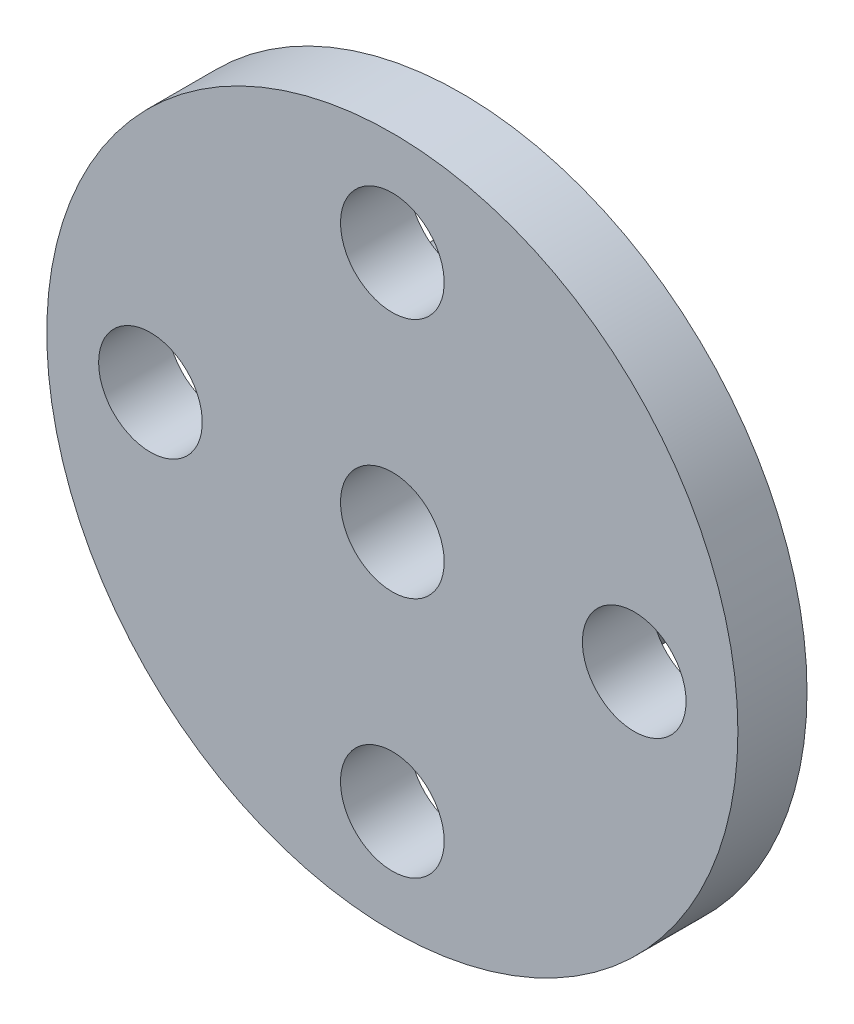
ISO-10303-21;
HEADER;
FILE_DESCRIPTION(('STEP AP214'),'2;1');
FILE_NAME('part.step','',(''),(''),'','','');
FILE_SCHEMA(('AUTOMOTIVE_DESIGN { 1 0 10303 214 1 1 1 1 }'));
ENDSEC;
DATA;
#1=APPLICATION_CONTEXT('core data for automotive mechanical design processes');
#2=APPLICATION_PROTOCOL_DEFINITION('international standard','automotive_design',2000,#1);
#3=PRODUCT_CONTEXT('',#1,'mechanical');
#4=PRODUCT('Part','Part','',(#3));
#5=PRODUCT_RELATED_PRODUCT_CATEGORY('part','',(#4));
#6=PRODUCT_DEFINITION_FORMATION('','',#4);
#7=PRODUCT_DEFINITION_CONTEXT('part definition',#1,'design');
#8=PRODUCT_DEFINITION('design','',#6,#7);
#9=PRODUCT_DEFINITION_SHAPE('','',#8);
#10=(LENGTH_UNIT() NAMED_UNIT(*) SI_UNIT(.MILLI.,.METRE.));
#11=(NAMED_UNIT(*) PLANE_ANGLE_UNIT() SI_UNIT($,.RADIAN.));
#12=(NAMED_UNIT(*) SI_UNIT($,.STERADIAN.) SOLID_ANGLE_UNIT());
#13=UNCERTAINTY_MEASURE_WITH_UNIT(LENGTH_MEASURE(1.E-05),#10,'distance_accuracy_value','');
#14=(GEOMETRIC_REPRESENTATION_CONTEXT(3) GLOBAL_UNCERTAINTY_ASSIGNED_CONTEXT((#13)) GLOBAL_UNIT_ASSIGNED_CONTEXT((#10,
#11,#12)) REPRESENTATION_CONTEXT('',''));
#15=CARTESIAN_POINT('',(0.,0.,0.));
#16=DIRECTION('',(0.,0.,1.));
#17=DIRECTION('',(1.,0.,0.));
#18=AXIS2_PLACEMENT_3D('',#15,#16,#17);
#19=CARTESIAN_POINT('',(0.,0.,0.));
#20=DIRECTION('',(0.,0.,1.));
#21=DIRECTION('',(1.,0.,0.));
#22=AXIS2_PLACEMENT_3D('',#19,#20,#21);
#23=PLANE('',#22);
#24=CARTESIAN_POINT('',(-7.,0.,0.));
#25=DIRECTION('',(0.,0.,1.));
#26=DIRECTION('',(-1.,0.,0.));
#27=AXIS2_PLACEMENT_3D('',#24,#25,#26);
#28=CIRCLE('',#27,1.5);
#29=CARTESIAN_POINT('',(-8.5,0.,0.));
#30=VERTEX_POINT('',#29);
#31=EDGE_CURVE('E82',#30,#30,#28,.T.);
#32=ORIENTED_EDGE('',*,*,#31,.T.);
#33=EDGE_LOOP('',(#32));
#34=FACE_BOUND('',#33,.T.);
#35=CARTESIAN_POINT('',(0.,-7.,0.));
#36=DIRECTION('',(0.,0.,1.));
#37=DIRECTION('',(1.,0.,0.));
#38=AXIS2_PLACEMENT_3D('',#35,#36,#37);
#39=CIRCLE('',#38,1.5);
#40=CARTESIAN_POINT('',(1.49999999999997,-7.,0.));
#41=VERTEX_POINT('',#40);
#42=EDGE_CURVE('E74',#41,#41,#39,.T.);
#43=ORIENTED_EDGE('',*,*,#42,.T.);
#44=EDGE_LOOP('',(#43));
#45=FACE_BOUND('',#44,.T.);
#46=CARTESIAN_POINT('',(0.,7.,0.));
#47=DIRECTION('',(0.,0.,1.));
#48=DIRECTION('',(-1.,0.,0.));
#49=AXIS2_PLACEMENT_3D('',#46,#47,#48);
#50=CIRCLE('',#49,1.5);
#51=CARTESIAN_POINT('',(-1.50000000000003,7.,0.));
#52=VERTEX_POINT('',#51);
#53=EDGE_CURVE('E66',#52,#52,#50,.T.);
#54=ORIENTED_EDGE('',*,*,#53,.T.);
#55=EDGE_LOOP('',(#54));
#56=FACE_BOUND('',#55,.T.);
#57=CARTESIAN_POINT('',(7.,0.,0.));
#58=DIRECTION('',(0.,0.,1.));
#59=DIRECTION('',(1.,0.,0.));
#60=AXIS2_PLACEMENT_3D('',#57,#58,#59);
#61=CIRCLE('',#60,1.5);
#62=CARTESIAN_POINT('',(8.5,0.,0.));
#63=VERTEX_POINT('',#62);
#64=EDGE_CURVE('E58',#63,#63,#61,.T.);
#65=ORIENTED_EDGE('',*,*,#64,.T.);
#66=EDGE_LOOP('',(#65));
#67=FACE_BOUND('',#66,.T.);
#68=CARTESIAN_POINT('',(0.,0.,0.));
#69=DIRECTION('',(0.,0.,1.));
#70=DIRECTION('',(1.,0.,0.));
#71=AXIS2_PLACEMENT_3D('',#68,#69,#70);
#72=CIRCLE('',#71,10.);
#73=CARTESIAN_POINT('',(10.,0.,0.));
#74=VERTEX_POINT('',#73);
#75=EDGE_CURVE('E50',#74,#74,#72,.T.);
#76=ORIENTED_EDGE('',*,*,#75,.F.);
#77=EDGE_LOOP('',(#76));
#78=FACE_BOUND('',#77,.T.);
#79=CARTESIAN_POINT('',(0.,0.,0.));
#80=DIRECTION('',(0.,0.,1.));
#81=DIRECTION('',(1.,0.,0.));
#82=AXIS2_PLACEMENT_3D('',#79,#80,#81);
#83=CIRCLE('',#82,4.75);
#84=CARTESIAN_POINT('',(4.75,0.,0.));
#85=VERTEX_POINT('',#84);
#86=EDGE_CURVE('E10',#85,#85,#83,.F.);
#87=ORIENTED_EDGE('',*,*,#86,.F.);
#88=EDGE_LOOP('',(#87));
#89=FACE_BOUND('',#88,.T.);
#90=ADVANCED_FACE('F37',(#34,#45,#56,#67,#78,#89),#23,.F.);
#91=CARTESIAN_POINT('',(0.,0.,2.));
#92=DIRECTION('',(0.,0.,1.));
#93=DIRECTION('',(1.,0.,0.));
#94=AXIS2_PLACEMENT_3D('',#91,#92,#93);
#95=PLANE('',#94);
#96=CARTESIAN_POINT('',(-7.,0.,2.));
#97=DIRECTION('',(0.,0.,1.));
#98=DIRECTION('',(-1.,0.,0.));
#99=AXIS2_PLACEMENT_3D('',#96,#97,#98);
#100=CIRCLE('',#99,1.5);
#101=CARTESIAN_POINT('',(-8.5,0.,2.));
#102=VERTEX_POINT('',#101);
#103=EDGE_CURVE('E78',#102,#102,#100,.T.);
#104=ORIENTED_EDGE('',*,*,#103,.F.);
#105=EDGE_LOOP('',(#104));
#106=FACE_BOUND('',#105,.T.);
#107=CARTESIAN_POINT('',(0.,7.,2.));
#108=DIRECTION('',(0.,0.,1.));
#109=DIRECTION('',(-1.,0.,0.));
#110=AXIS2_PLACEMENT_3D('',#107,#108,#109);
#111=CIRCLE('',#110,1.5);
#112=CARTESIAN_POINT('',(-1.50000000000003,7.,2.));
#113=VERTEX_POINT('',#112);
#114=EDGE_CURVE('E62',#113,#113,#111,.T.);
#115=ORIENTED_EDGE('',*,*,#114,.F.);
#116=EDGE_LOOP('',(#115));
#117=FACE_BOUND('',#116,.T.);
#118=CARTESIAN_POINT('',(0.,0.,2.));
#119=DIRECTION('',(0.,0.,1.));
#120=DIRECTION('',(1.,0.,0.));
#121=AXIS2_PLACEMENT_3D('',#118,#119,#120);
#122=CIRCLE('',#121,10.);
#123=CARTESIAN_POINT('',(10.,0.,2.));
#124=VERTEX_POINT('',#123);
#125=EDGE_CURVE('E45',#124,#124,#122,.T.);
#126=ORIENTED_EDGE('',*,*,#125,.T.);
#127=EDGE_LOOP('',(#126));
#128=FACE_BOUND('',#127,.T.);
#129=CARTESIAN_POINT('',(7.,0.,2.));
#130=DIRECTION('',(0.,0.,1.));
#131=DIRECTION('',(1.,0.,0.));
#132=AXIS2_PLACEMENT_3D('',#129,#130,#131);
#133=CIRCLE('',#132,1.5);
#134=CARTESIAN_POINT('',(8.5,0.,2.));
#135=VERTEX_POINT('',#134);
#136=EDGE_CURVE('E56',#135,#135,#133,.T.);
#137=ORIENTED_EDGE('',*,*,#136,.F.);
#138=EDGE_LOOP('',(#137));
#139=FACE_BOUND('',#138,.T.);
#140=CARTESIAN_POINT('',(0.,-7.,2.));
#141=DIRECTION('',(0.,0.,1.));
#142=DIRECTION('',(1.,0.,0.));
#143=AXIS2_PLACEMENT_3D('',#140,#141,#142);
#144=CIRCLE('',#143,1.5);
#145=CARTESIAN_POINT('',(1.49999999999997,-7.,2.));
#146=VERTEX_POINT('',#145);
#147=EDGE_CURVE('E70',#146,#146,#144,.T.);
#148=ORIENTED_EDGE('',*,*,#147,.F.);
#149=EDGE_LOOP('',(#148));
#150=FACE_BOUND('',#149,.T.);
#151=CARTESIAN_POINT('',(0.,0.,2.));
#152=DIRECTION('',(0.,0.,1.));
#153=DIRECTION('',(1.,0.,0.));
#154=AXIS2_PLACEMENT_3D('',#151,#152,#153);
#155=CIRCLE('',#154,1.5);
#156=CARTESIAN_POINT('',(1.5,0.,2.));
#157=VERTEX_POINT('',#156);
#158=EDGE_CURVE('E86',#157,#157,#155,.T.);
#159=ORIENTED_EDGE('',*,*,#158,.F.);
#160=EDGE_LOOP('',(#159));
#161=FACE_BOUND('',#160,.T.);
#162=ADVANCED_FACE('F119',(#106,#117,#128,#139,#150,#161),#95,.T.);
#163=CARTESIAN_POINT('',(0.,0.,2.));
#164=DIRECTION('',(0.,0.,-1.));
#165=DIRECTION('',(-1.,0.,0.));
#166=AXIS2_PLACEMENT_3D('',#163,#164,#165);
#167=CYLINDRICAL_SURFACE('',#166,10.);
#168=ORIENTED_EDGE('',*,*,#125,.F.);
#169=EDGE_LOOP('',(#168));
#170=FACE_BOUND('',#169,.T.);
#171=ORIENTED_EDGE('',*,*,#75,.T.);
#172=EDGE_LOOP('',(#171));
#173=FACE_BOUND('',#172,.T.);
#174=ADVANCED_FACE('F39',(#170,#173),#167,.T.);
#175=CARTESIAN_POINT('',(7.,0.,2.));
#176=DIRECTION('',(0.,0.,-1.));
#177=DIRECTION('',(-1.,0.,0.));
#178=AXIS2_PLACEMENT_3D('',#175,#176,#177);
#179=CYLINDRICAL_SURFACE('',#178,1.5);
#180=ORIENTED_EDGE('',*,*,#136,.T.);
#181=EDGE_LOOP('',(#180));
#182=FACE_BOUND('',#181,.T.);
#183=ORIENTED_EDGE('',*,*,#64,.F.);
#184=EDGE_LOOP('',(#183));
#185=FACE_BOUND('',#184,.T.);
#186=ADVANCED_FACE('F128',(#182,#185),#179,.F.);
#187=CARTESIAN_POINT('',(0.,7.,2.));
#188=DIRECTION('',(0.,0.,-1.));
#189=DIRECTION('',(-1.,0.,0.));
#190=AXIS2_PLACEMENT_3D('',#187,#188,#189);
#191=CYLINDRICAL_SURFACE('',#190,1.5);
#192=ORIENTED_EDGE('',*,*,#114,.T.);
#193=EDGE_LOOP('',(#192));
#194=FACE_BOUND('',#193,.T.);
#195=ORIENTED_EDGE('',*,*,#53,.F.);
#196=EDGE_LOOP('',(#195));
#197=FACE_BOUND('',#196,.T.);
#198=ADVANCED_FACE('F131',(#194,#197),#191,.F.);
#199=CARTESIAN_POINT('',(0.,-7.,2.));
#200=DIRECTION('',(0.,0.,-1.));
#201=DIRECTION('',(-1.,0.,0.));
#202=AXIS2_PLACEMENT_3D('',#199,#200,#201);
#203=CYLINDRICAL_SURFACE('',#202,1.5);
#204=ORIENTED_EDGE('',*,*,#147,.T.);
#205=EDGE_LOOP('',(#204));
#206=FACE_BOUND('',#205,.T.);
#207=ORIENTED_EDGE('',*,*,#42,.F.);
#208=EDGE_LOOP('',(#207));
#209=FACE_BOUND('',#208,.T.);
#210=ADVANCED_FACE('F135',(#206,#209),#203,.F.);
#211=CARTESIAN_POINT('',(-7.,0.,2.));
#212=DIRECTION('',(0.,0.,-1.));
#213=DIRECTION('',(-1.,0.,0.));
#214=AXIS2_PLACEMENT_3D('',#211,#212,#213);
#215=CYLINDRICAL_SURFACE('',#214,1.5);
#216=ORIENTED_EDGE('',*,*,#103,.T.);
#217=EDGE_LOOP('',(#216));
#218=FACE_BOUND('',#217,.T.);
#219=ORIENTED_EDGE('',*,*,#31,.F.);
#220=EDGE_LOOP('',(#219));
#221=FACE_BOUND('',#220,.T.);
#222=ADVANCED_FACE('F115',(#218,#221),#215,.F.);
#223=CARTESIAN_POINT('',(0.,0.,2.));
#224=DIRECTION('',(0.,0.,-1.));
#225=DIRECTION('',(-1.,0.,0.));
#226=AXIS2_PLACEMENT_3D('',#223,#224,#225);
#227=CYLINDRICAL_SURFACE('',#226,1.5);
#228=ORIENTED_EDGE('',*,*,#158,.T.);
#229=EDGE_LOOP('',(#228));
#230=FACE_BOUND('',#229,.T.);
#231=CARTESIAN_POINT('',(0.,0.,-3.5));
#232=DIRECTION('',(0.,0.,-1.));
#233=DIRECTION('',(-1.,0.,0.));
#234=AXIS2_PLACEMENT_3D('',#231,#232,#233);
#235=CIRCLE('',#234,1.5);
#236=CARTESIAN_POINT('',(-1.5,0.,-3.5));
#237=VERTEX_POINT('',#236);
#238=EDGE_CURVE('E97',#237,#237,#235,.T.);
#239=ORIENTED_EDGE('',*,*,#238,.T.);
#240=EDGE_LOOP('',(#239));
#241=FACE_BOUND('',#240,.T.);
#242=ADVANCED_FACE('F102',(#230,#241),#227,.F.);
#243=CARTESIAN_POINT('',(0.,0.,-3.5));
#244=DIRECTION('',(0.,0.,-1.));
#245=DIRECTION('',(-1.,0.,0.));
#246=AXIS2_PLACEMENT_3D('',#243,#244,#245);
#247=PLANE('',#246);
#248=CARTESIAN_POINT('',(0.,0.,-3.5));
#249=DIRECTION('',(0.,0.,-1.));
#250=DIRECTION('',(-1.,0.,0.));
#251=AXIS2_PLACEMENT_3D('',#248,#249,#250);
#252=CIRCLE('',#251,4.75);
#253=CARTESIAN_POINT('',(-4.75,0.,-3.5));
#254=VERTEX_POINT('',#253);
#255=EDGE_CURVE('E93',#254,#254,#252,.T.);
#256=ORIENTED_EDGE('',*,*,#255,.T.);
#257=EDGE_LOOP('',(#256));
#258=FACE_BOUND('',#257,.T.);
#259=ORIENTED_EDGE('',*,*,#238,.F.);
#260=EDGE_LOOP('',(#259));
#261=FACE_BOUND('',#260,.T.);
#262=ADVANCED_FACE('F104',(#258,#261),#247,.T.);
#263=CARTESIAN_POINT('',(0.,0.,-3.5));
#264=DIRECTION('',(0.,0.,1.));
#265=DIRECTION('',(1.,0.,0.));
#266=AXIS2_PLACEMENT_3D('',#263,#264,#265);
#267=CYLINDRICAL_SURFACE('',#266,4.75);
#268=ORIENTED_EDGE('',*,*,#255,.F.);
#269=EDGE_LOOP('',(#268));
#270=FACE_BOUND('',#269,.T.);
#271=ORIENTED_EDGE('',*,*,#86,.T.);
#272=EDGE_LOOP('',(#271));
#273=FACE_BOUND('',#272,.T.);
#274=ADVANCED_FACE('F106',(#270,#273),#267,.T.);
#275=CLOSED_SHELL('',(#90,#162,#174,#186,#198,#210,#222,#242,#262,#274));
#276=MANIFOLD_SOLID_BREP('B2',#275);
#277=ADVANCED_BREP_SHAPE_REPRESENTATION('',(#18,#276),#14);
#278=SHAPE_DEFINITION_REPRESENTATION(#9,#277);
ENDSEC;
END-ISO-10303-21;
